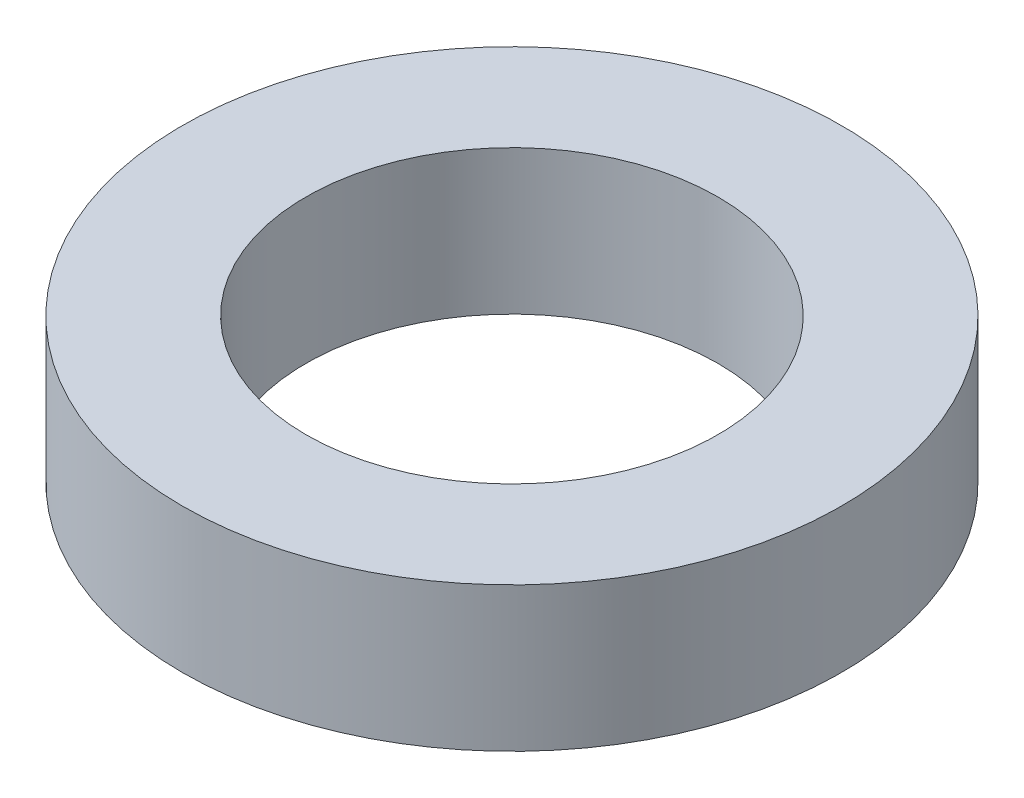
ISO-10303-21;
HEADER;
FILE_DESCRIPTION(('STEP AP214'),'2;1');
FILE_NAME('part.step','',(''),(''),'','','');
FILE_SCHEMA(('AUTOMOTIVE_DESIGN { 1 0 10303 214 1 1 1 1 }'));
ENDSEC;
DATA;
#1=APPLICATION_CONTEXT('core data for automotive mechanical design processes');
#2=APPLICATION_PROTOCOL_DEFINITION('international standard','automotive_design',2000,#1);
#3=PRODUCT_CONTEXT('',#1,'mechanical');
#4=PRODUCT('Part','Part','',(#3));
#5=PRODUCT_RELATED_PRODUCT_CATEGORY('part','',(#4));
#6=PRODUCT_DEFINITION_FORMATION('','',#4);
#7=PRODUCT_DEFINITION_CONTEXT('part definition',#1,'design');
#8=PRODUCT_DEFINITION('design','',#6,#7);
#9=PRODUCT_DEFINITION_SHAPE('','',#8);
#10=(LENGTH_UNIT() NAMED_UNIT(*) SI_UNIT(.MILLI.,.METRE.));
#11=(NAMED_UNIT(*) PLANE_ANGLE_UNIT() SI_UNIT($,.RADIAN.));
#12=(NAMED_UNIT(*) SI_UNIT($,.STERADIAN.) SOLID_ANGLE_UNIT());
#13=UNCERTAINTY_MEASURE_WITH_UNIT(LENGTH_MEASURE(1.E-05),#10,'distance_accuracy_value','');
#14=(GEOMETRIC_REPRESENTATION_CONTEXT(3) GLOBAL_UNCERTAINTY_ASSIGNED_CONTEXT((#13)) GLOBAL_UNIT_ASSIGNED_CONTEXT((#10,
#11,#12)) REPRESENTATION_CONTEXT('',''));
#15=CARTESIAN_POINT('',(0.,0.,0.));
#16=DIRECTION('',(0.,0.,1.));
#17=DIRECTION('',(1.,0.,0.));
#18=AXIS2_PLACEMENT_3D('',#15,#16,#17);
#19=CARTESIAN_POINT('',(0.,7.,0.));
#20=DIRECTION('',(0.,1.,0.));
#21=DIRECTION('',(0.,0.,1.));
#22=AXIS2_PLACEMENT_3D('',#19,#20,#21);
#23=PLANE('',#22);
#24=CARTESIAN_POINT('',(0.,7.,0.));
#25=DIRECTION('',(0.,1.,0.));
#26=DIRECTION('',(0.,0.,1.));
#27=AXIS2_PLACEMENT_3D('',#24,#25,#26);
#28=CIRCLE('',#27,16.);
#29=CARTESIAN_POINT('',(0.,7.,16.));
#30=VERTEX_POINT('',#29);
#31=EDGE_CURVE('E10',#30,#30,#28,.T.);
#32=ORIENTED_EDGE('',*,*,#31,.T.);
#33=EDGE_LOOP('',(#32));
#34=FACE_BOUND('',#33,.T.);
#35=CARTESIAN_POINT('',(0.,7.,0.));
#36=DIRECTION('',(0.,1.,0.));
#37=DIRECTION('',(0.,0.,1.));
#38=AXIS2_PLACEMENT_3D('',#35,#36,#37);
#39=CIRCLE('',#38,10.);
#40=CARTESIAN_POINT('',(0.,7.,10.));
#41=VERTEX_POINT('',#40);
#42=EDGE_CURVE('E44',#41,#41,#39,.T.);
#43=ORIENTED_EDGE('',*,*,#42,.F.);
#44=EDGE_LOOP('',(#43));
#45=FACE_BOUND('',#44,.T.);
#46=ADVANCED_FACE('F33',(#34,#45),#23,.T.);
#47=CARTESIAN_POINT('',(0.,0.,0.));
#48=DIRECTION('',(0.,1.,0.));
#49=DIRECTION('',(0.,0.,1.));
#50=AXIS2_PLACEMENT_3D('',#47,#48,#49);
#51=PLANE('',#50);
#52=CARTESIAN_POINT('',(0.,0.,0.));
#53=DIRECTION('',(0.,1.,0.));
#54=DIRECTION('',(0.,0.,1.));
#55=AXIS2_PLACEMENT_3D('',#52,#53,#54);
#56=CIRCLE('',#55,16.);
#57=CARTESIAN_POINT('',(0.,0.,16.));
#58=VERTEX_POINT('',#57);
#59=EDGE_CURVE('E37',#58,#58,#56,.T.);
#60=ORIENTED_EDGE('',*,*,#59,.F.);
#61=EDGE_LOOP('',(#60));
#62=FACE_BOUND('',#61,.T.);
#63=CARTESIAN_POINT('',(0.,0.,0.));
#64=DIRECTION('',(0.,1.,0.));
#65=DIRECTION('',(0.,0.,1.));
#66=AXIS2_PLACEMENT_3D('',#63,#64,#65);
#67=CIRCLE('',#66,10.);
#68=CARTESIAN_POINT('',(0.,0.,10.));
#69=VERTEX_POINT('',#68);
#70=EDGE_CURVE('E46',#69,#69,#67,.T.);
#71=ORIENTED_EDGE('',*,*,#70,.T.);
#72=EDGE_LOOP('',(#71));
#73=FACE_BOUND('',#72,.T.);
#74=ADVANCED_FACE('F56',(#62,#73),#51,.F.);
#75=CARTESIAN_POINT('',(0.,7.,0.));
#76=DIRECTION('',(0.,-1.,0.));
#77=DIRECTION('',(0.,0.,-1.));
#78=AXIS2_PLACEMENT_3D('',#75,#76,#77);
#79=CYLINDRICAL_SURFACE('',#78,16.);
#80=ORIENTED_EDGE('',*,*,#31,.F.);
#81=EDGE_LOOP('',(#80));
#82=FACE_BOUND('',#81,.T.);
#83=ORIENTED_EDGE('',*,*,#59,.T.);
#84=EDGE_LOOP('',(#83));
#85=FACE_BOUND('',#84,.T.);
#86=ADVANCED_FACE('F35',(#82,#85),#79,.T.);
#87=CARTESIAN_POINT('',(0.,7.,0.));
#88=DIRECTION('',(0.,-1.,0.));
#89=DIRECTION('',(0.,0.,-1.));
#90=AXIS2_PLACEMENT_3D('',#87,#88,#89);
#91=CYLINDRICAL_SURFACE('',#90,10.);
#92=ORIENTED_EDGE('',*,*,#42,.T.);
#93=EDGE_LOOP('',(#92));
#94=FACE_BOUND('',#93,.T.);
#95=ORIENTED_EDGE('',*,*,#70,.F.);
#96=EDGE_LOOP('',(#95));
#97=FACE_BOUND('',#96,.T.);
#98=ADVANCED_FACE('F52',(#94,#97),#91,.F.);
#99=CLOSED_SHELL('',(#46,#74,#86,#98));
#100=MANIFOLD_SOLID_BREP('B2',#99);
#101=ADVANCED_BREP_SHAPE_REPRESENTATION('',(#18,#100),#14);
#102=SHAPE_DEFINITION_REPRESENTATION(#9,#101);
ENDSEC;
END-ISO-10303-21;
